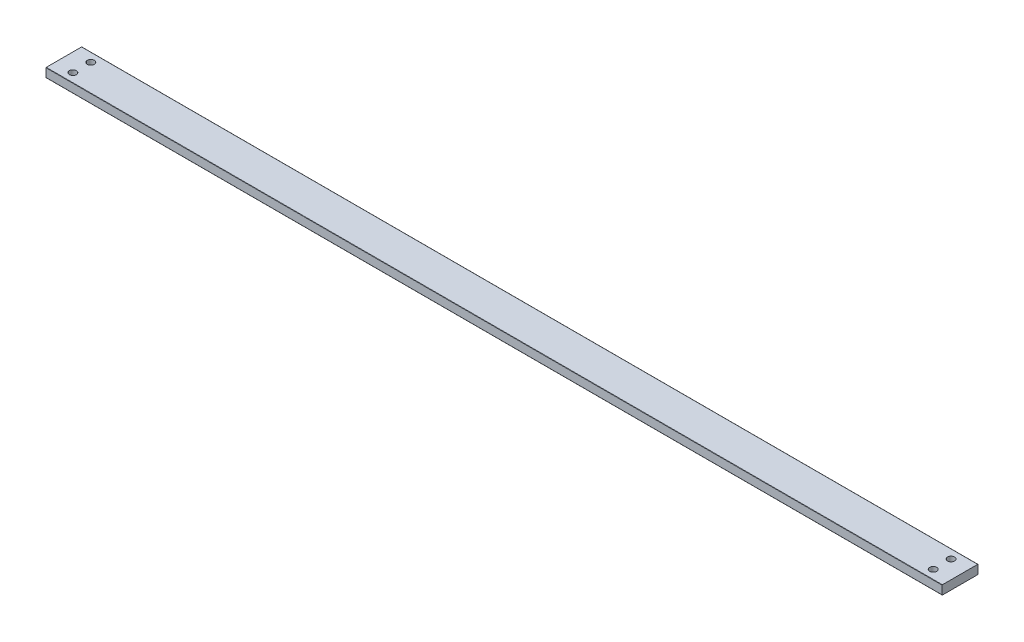
ISO-10303-21;
HEADER;
FILE_DESCRIPTION(('STEP AP214'),'2;1');
FILE_NAME('part.step','',(''),(''),'','','');
FILE_SCHEMA(('AUTOMOTIVE_DESIGN { 1 0 10303 214 1 1 1 1 }'));
ENDSEC;
DATA;
#1=APPLICATION_CONTEXT('core data for automotive mechanical design processes');
#2=APPLICATION_PROTOCOL_DEFINITION('international standard','automotive_design',2000,#1);
#3=PRODUCT_CONTEXT('',#1,'mechanical');
#4=PRODUCT('Part','Part','',(#3));
#5=PRODUCT_RELATED_PRODUCT_CATEGORY('part','',(#4));
#6=PRODUCT_DEFINITION_FORMATION('','',#4);
#7=PRODUCT_DEFINITION_CONTEXT('part definition',#1,'design');
#8=PRODUCT_DEFINITION('design','',#6,#7);
#9=PRODUCT_DEFINITION_SHAPE('','',#8);
#10=(LENGTH_UNIT() NAMED_UNIT(*) SI_UNIT(.MILLI.,.METRE.));
#11=(NAMED_UNIT(*) PLANE_ANGLE_UNIT() SI_UNIT($,.RADIAN.));
#12=(NAMED_UNIT(*) SI_UNIT($,.STERADIAN.) SOLID_ANGLE_UNIT());
#13=UNCERTAINTY_MEASURE_WITH_UNIT(LENGTH_MEASURE(1.E-05),#10,'distance_accuracy_value','');
#14=(GEOMETRIC_REPRESENTATION_CONTEXT(3) GLOBAL_UNCERTAINTY_ASSIGNED_CONTEXT((#13)) GLOBAL_UNIT_ASSIGNED_CONTEXT((#10,
#11,#12)) REPRESENTATION_CONTEXT('',''));
#15=CARTESIAN_POINT('',(0.,0.,0.));
#16=DIRECTION('',(0.,0.,1.));
#17=DIRECTION('',(1.,0.,0.));
#18=AXIS2_PLACEMENT_3D('',#15,#16,#17);
#19=CARTESIAN_POINT('',(-317.5,-3.17500000000001,-12.7));
#20=DIRECTION('',(-1.,0.,0.));
#21=DIRECTION('',(0.,0.,1.));
#22=AXIS2_PLACEMENT_3D('',#19,#20,#21);
#23=PLANE('',#22);
#24=DIRECTION('',(0.,0.,1.));
#25=VECTOR('',#24,1.);
#26=CARTESIAN_POINT('',(-317.5,-3.17500000000001,-12.7));
#27=LINE('',#26,#25);
#28=CARTESIAN_POINT('',(-317.5,-3.17500000000001,-12.49045));
#29=VERTEX_POINT('',#28);
#30=CARTESIAN_POINT('',(-317.5,-3.17500000000001,12.49045));
#31=VERTEX_POINT('',#30);
#32=EDGE_CURVE('E192',#29,#31,#27,.T.);
#33=ORIENTED_EDGE('',*,*,#32,.T.);
#34=CARTESIAN_POINT('',(-317.5,-2.96545000000001,12.49045));
#35=DIRECTION('',(-1.,0.,0.));
#36=DIRECTION('',(0.,0.,1.));
#37=AXIS2_PLACEMENT_3D('',#34,#35,#36);
#38=CIRCLE('',#37,0.20955);
#39=CARTESIAN_POINT('',(-317.5,-2.96545000000001,12.7));
#40=VERTEX_POINT('',#39);
#41=EDGE_CURVE('E170',#31,#40,#38,.T.);
#42=ORIENTED_EDGE('',*,*,#41,.T.);
#43=DIRECTION('',(0.,1.,0.));
#44=VECTOR('',#43,1.);
#45=CARTESIAN_POINT('',(-317.5,-3.17500000000001,12.7));
#46=LINE('',#45,#44);
#47=CARTESIAN_POINT('',(-317.5,2.96544999999999,12.7));
#48=VERTEX_POINT('',#47);
#49=EDGE_CURVE('E131',#40,#48,#46,.T.);
#50=ORIENTED_EDGE('',*,*,#49,.T.);
#51=CARTESIAN_POINT('',(-317.5,2.96544999999999,12.49045));
#52=DIRECTION('',(-1.,0.,0.));
#53=DIRECTION('',(0.,0.,1.));
#54=AXIS2_PLACEMENT_3D('',#51,#52,#53);
#55=CIRCLE('',#54,0.20955);
#56=CARTESIAN_POINT('',(-317.5,3.17499999999999,12.49045));
#57=VERTEX_POINT('',#56);
#58=EDGE_CURVE('E163',#48,#57,#55,.T.);
#59=ORIENTED_EDGE('',*,*,#58,.T.);
#60=DIRECTION('',(0.,0.,1.));
#61=VECTOR('',#60,1.);
#62=CARTESIAN_POINT('',(-317.5,3.17499999999999,-12.7));
#63=LINE('',#62,#61);
#64=CARTESIAN_POINT('',(-317.5,3.17499999999999,-12.49045));
#65=VERTEX_POINT('',#64);
#66=EDGE_CURVE('E187',#65,#57,#63,.T.);
#67=ORIENTED_EDGE('',*,*,#66,.F.);
#68=CARTESIAN_POINT('',(-317.5,2.96544999999999,-12.49045));
#69=DIRECTION('',(-1.,0.,0.));
#70=DIRECTION('',(0.,0.,1.));
#71=AXIS2_PLACEMENT_3D('',#68,#69,#70);
#72=CIRCLE('',#71,0.20955);
#73=CARTESIAN_POINT('',(-317.5,2.96544999999999,-12.7));
#74=VERTEX_POINT('',#73);
#75=EDGE_CURVE('E58',#65,#74,#72,.T.);
#76=ORIENTED_EDGE('',*,*,#75,.T.);
#77=DIRECTION('',(0.,1.,0.));
#78=VECTOR('',#77,1.);
#79=CARTESIAN_POINT('',(-317.5,-3.17500000000001,-12.7));
#80=LINE('',#79,#78);
#81=CARTESIAN_POINT('',(-317.5,-2.96545000000001,-12.7));
#82=VERTEX_POINT('',#81);
#83=EDGE_CURVE('E144',#82,#74,#80,.T.);
#84=ORIENTED_EDGE('',*,*,#83,.F.);
#85=CARTESIAN_POINT('',(-317.5,-2.96545000000001,-12.49045));
#86=DIRECTION('',(-1.,0.,0.));
#87=DIRECTION('',(0.,0.,1.));
#88=AXIS2_PLACEMENT_3D('',#85,#86,#87);
#89=CIRCLE('',#88,0.20955);
#90=EDGE_CURVE('E66',#82,#29,#89,.T.);
#91=ORIENTED_EDGE('',*,*,#90,.T.);
#92=EDGE_LOOP('',(#33,#42,#50,#59,#67,#76,#84,#91));
#93=FACE_BOUND('',#92,.T.);
#94=ADVANCED_FACE('F42',(#93),#23,.T.);
#95=CARTESIAN_POINT('',(-317.5,-3.17500000000001,-12.7));
#96=DIRECTION('',(0.,0.,-1.));
#97=DIRECTION('',(-1.,0.,0.));
#98=AXIS2_PLACEMENT_3D('',#95,#96,#97);
#99=PLANE('',#98);
#100=DIRECTION('',(0.,1.,0.));
#101=VECTOR('',#100,1.);
#102=CARTESIAN_POINT('',(317.5,-3.17500000000001,-12.7));
#103=LINE('',#102,#101);
#104=CARTESIAN_POINT('',(317.5,-2.96545000000001,-12.7));
#105=VERTEX_POINT('',#104);
#106=CARTESIAN_POINT('',(317.5,2.96544999999999,-12.7));
#107=VERTEX_POINT('',#106);
#108=EDGE_CURVE('E139',#105,#107,#103,.T.);
#109=ORIENTED_EDGE('',*,*,#108,.F.);
#110=DIRECTION('',(-1.,0.,0.));
#111=VECTOR('',#110,1.);
#112=CARTESIAN_POINT('',(-317.5,-2.96545000000001,-12.7));
#113=LINE('',#112,#111);
#114=EDGE_CURVE('E176',#105,#82,#113,.T.);
#115=ORIENTED_EDGE('',*,*,#114,.T.);
#116=ORIENTED_EDGE('',*,*,#83,.T.);
#117=DIRECTION('',(-1.,0.,0.));
#118=VECTOR('',#117,1.);
#119=CARTESIAN_POINT('',(-317.5,2.96544999999999,-12.7));
#120=LINE('',#119,#118);
#121=EDGE_CURVE('E173',#74,#107,#120,.F.);
#122=ORIENTED_EDGE('',*,*,#121,.T.);
#123=EDGE_LOOP('',(#109,#115,#116,#122));
#124=FACE_BOUND('',#123,.T.);
#125=ADVANCED_FACE('F207',(#124),#99,.T.);
#126=CARTESIAN_POINT('',(317.5,-3.17500000000001,-12.7));
#127=DIRECTION('',(1.,0.,0.));
#128=DIRECTION('',(0.,0.,-1.));
#129=AXIS2_PLACEMENT_3D('',#126,#127,#128);
#130=PLANE('',#129);
#131=DIRECTION('',(0.,1.,0.));
#132=VECTOR('',#131,1.);
#133=CARTESIAN_POINT('',(317.5,-3.17500000000001,12.7));
#134=LINE('',#133,#132);
#135=CARTESIAN_POINT('',(317.5,-2.96545000000001,12.7));
#136=VERTEX_POINT('',#135);
#137=CARTESIAN_POINT('',(317.5,2.96544999999999,12.7));
#138=VERTEX_POINT('',#137);
#139=EDGE_CURVE('E128',#136,#138,#134,.T.);
#140=ORIENTED_EDGE('',*,*,#139,.F.);
#141=CARTESIAN_POINT('',(317.5,-2.96545000000001,12.49045));
#142=DIRECTION('',(1.,0.,0.));
#143=DIRECTION('',(0.,0.,-1.));
#144=AXIS2_PLACEMENT_3D('',#141,#142,#143);
#145=CIRCLE('',#144,0.20955);
#146=CARTESIAN_POINT('',(317.5,-3.17500000000001,12.49045));
#147=VERTEX_POINT('',#146);
#148=EDGE_CURVE('E110',#136,#147,#145,.T.);
#149=ORIENTED_EDGE('',*,*,#148,.T.);
#150=DIRECTION('',(0.,0.,-1.));
#151=VECTOR('',#150,1.);
#152=CARTESIAN_POINT('',(317.5,-3.17500000000001,-12.7));
#153=LINE('',#152,#151);
#154=CARTESIAN_POINT('',(317.5,-3.17500000000001,-12.49045));
#155=VERTEX_POINT('',#154);
#156=EDGE_CURVE('E146',#147,#155,#153,.T.);
#157=ORIENTED_EDGE('',*,*,#156,.T.);
#158=CARTESIAN_POINT('',(317.5,-2.96545000000001,-12.49045));
#159=DIRECTION('',(1.,0.,0.));
#160=DIRECTION('',(0.,0.,-1.));
#161=AXIS2_PLACEMENT_3D('',#158,#159,#160);
#162=CIRCLE('',#161,0.20955);
#163=EDGE_CURVE('E122',#155,#105,#162,.T.);
#164=ORIENTED_EDGE('',*,*,#163,.T.);
#165=ORIENTED_EDGE('',*,*,#108,.T.);
#166=CARTESIAN_POINT('',(317.5,2.96544999999999,-12.49045));
#167=DIRECTION('',(1.,0.,0.));
#168=DIRECTION('',(0.,0.,-1.));
#169=AXIS2_PLACEMENT_3D('',#166,#167,#168);
#170=CIRCLE('',#169,0.20955);
#171=CARTESIAN_POINT('',(317.5,3.17499999999999,-12.49045));
#172=VERTEX_POINT('',#171);
#173=EDGE_CURVE('E154',#107,#172,#170,.T.);
#174=ORIENTED_EDGE('',*,*,#173,.T.);
#175=DIRECTION('',(0.,0.,-1.));
#176=VECTOR('',#175,1.);
#177=CARTESIAN_POINT('',(317.5,3.17499999999999,-12.7));
#178=LINE('',#177,#176);
#179=CARTESIAN_POINT('',(317.5,3.17499999999999,12.49045));
#180=VERTEX_POINT('',#179);
#181=EDGE_CURVE('E185',#180,#172,#178,.T.);
#182=ORIENTED_EDGE('',*,*,#181,.F.);
#183=CARTESIAN_POINT('',(317.5,2.96544999999999,12.49045));
#184=DIRECTION('',(1.,0.,0.));
#185=DIRECTION('',(0.,0.,-1.));
#186=AXIS2_PLACEMENT_3D('',#183,#184,#185);
#187=CIRCLE('',#186,0.20955);
#188=EDGE_CURVE('E133',#180,#138,#187,.T.);
#189=ORIENTED_EDGE('',*,*,#188,.T.);
#190=EDGE_LOOP('',(#140,#149,#157,#164,#165,#174,#182,#189));
#191=FACE_BOUND('',#190,.T.);
#192=ADVANCED_FACE('F136',(#191),#130,.T.);
#193=CARTESIAN_POINT('',(-317.5,-3.17500000000001,12.7));
#194=DIRECTION('',(0.,0.,1.));
#195=DIRECTION('',(1.,0.,0.));
#196=AXIS2_PLACEMENT_3D('',#193,#194,#195);
#197=PLANE('',#196);
#198=ORIENTED_EDGE('',*,*,#49,.F.);
#199=DIRECTION('',(1.,0.,0.));
#200=VECTOR('',#199,1.);
#201=CARTESIAN_POINT('',(317.5,-2.96545000000001,12.7));
#202=LINE('',#201,#200);
#203=EDGE_CURVE('E114',#40,#136,#202,.T.);
#204=ORIENTED_EDGE('',*,*,#203,.T.);
#205=ORIENTED_EDGE('',*,*,#139,.T.);
#206=DIRECTION('',(1.,0.,0.));
#207=VECTOR('',#206,1.);
#208=CARTESIAN_POINT('',(-317.5,2.96544999999999,12.7));
#209=LINE('',#208,#207);
#210=EDGE_CURVE('E134',#138,#48,#209,.F.);
#211=ORIENTED_EDGE('',*,*,#210,.T.);
#212=EDGE_LOOP('',(#198,#204,#205,#211));
#213=FACE_BOUND('',#212,.T.);
#214=ADVANCED_FACE('F127',(#213),#197,.T.);
#215=CARTESIAN_POINT('',(0.,-3.17500000000001,0.));
#216=DIRECTION('',(0.,1.,0.));
#217=DIRECTION('',(0.,0.,1.));
#218=AXIS2_PLACEMENT_3D('',#215,#216,#217);
#219=PLANE('',#218);
#220=CARTESIAN_POINT('',(304.8,-3.17500000000001,6.35));
#221=DIRECTION('',(0.,1.,0.));
#222=DIRECTION('',(0.,0.,1.));
#223=AXIS2_PLACEMENT_3D('',#220,#221,#222);
#224=CIRCLE('',#223,2.48919999999997);
#225=CARTESIAN_POINT('',(304.8,-3.17500000000001,8.83919999999997));
#226=VERTEX_POINT('',#225);
#227=EDGE_CURVE('E367',#226,#226,#224,.T.);
#228=ORIENTED_EDGE('',*,*,#227,.T.);
#229=EDGE_LOOP('',(#228));
#230=FACE_BOUND('',#229,.T.);
#231=CARTESIAN_POINT('',(-304.8,-3.17500000000001,6.35));
#232=DIRECTION('',(0.,1.,0.));
#233=DIRECTION('',(0.,0.,1.));
#234=AXIS2_PLACEMENT_3D('',#231,#232,#233);
#235=CIRCLE('',#234,2.48919999999997);
#236=CARTESIAN_POINT('',(-304.8,-3.17500000000001,8.83919999999997));
#237=VERTEX_POINT('',#236);
#238=EDGE_CURVE('E380',#237,#237,#235,.T.);
#239=ORIENTED_EDGE('',*,*,#238,.T.);
#240=EDGE_LOOP('',(#239));
#241=FACE_BOUND('',#240,.T.);
#242=CARTESIAN_POINT('',(304.8,-3.17500000000001,-6.35));
#243=DIRECTION('',(0.,1.,0.));
#244=DIRECTION('',(0.,0.,1.));
#245=AXIS2_PLACEMENT_3D('',#242,#243,#244);
#246=CIRCLE('',#245,2.48919999999997);
#247=CARTESIAN_POINT('',(304.8,-3.17500000000001,-3.86080000000003));
#248=VERTEX_POINT('',#247);
#249=EDGE_CURVE('E388',#248,#248,#246,.T.);
#250=ORIENTED_EDGE('',*,*,#249,.T.);
#251=EDGE_LOOP('',(#250));
#252=FACE_BOUND('',#251,.T.);
#253=CARTESIAN_POINT('',(-304.8,-3.17500000000001,-6.35));
#254=DIRECTION('',(0.,1.,0.));
#255=DIRECTION('',(0.,0.,1.));
#256=AXIS2_PLACEMENT_3D('',#253,#254,#255);
#257=CIRCLE('',#256,2.48919999999997);
#258=CARTESIAN_POINT('',(-304.8,-3.17500000000001,-3.86080000000003));
#259=VERTEX_POINT('',#258);
#260=EDGE_CURVE('E198',#259,#259,#257,.T.);
#261=ORIENTED_EDGE('',*,*,#260,.T.);
#262=EDGE_LOOP('',(#261));
#263=FACE_BOUND('',#262,.T.);
#264=ORIENTED_EDGE('',*,*,#156,.F.);
#265=DIRECTION('',(1.,0.,0.));
#266=VECTOR('',#265,1.);
#267=CARTESIAN_POINT('',(-317.5,-3.17500000000001,12.49045));
#268=LINE('',#267,#266);
#269=EDGE_CURVE('E115',#147,#31,#268,.F.);
#270=ORIENTED_EDGE('',*,*,#269,.T.);
#271=ORIENTED_EDGE('',*,*,#32,.F.);
#272=DIRECTION('',(-1.,0.,0.));
#273=VECTOR('',#272,1.);
#274=CARTESIAN_POINT('',(317.5,-3.17500000000001,-12.49045));
#275=LINE('',#274,#273);
#276=EDGE_CURVE('E121',#29,#155,#275,.F.);
#277=ORIENTED_EDGE('',*,*,#276,.T.);
#278=EDGE_LOOP('',(#264,#270,#271,#277));
#279=FACE_BOUND('',#278,.T.);
#280=ADVANCED_FACE('F236',(#230,#241,#252,#263,#279),#219,.F.);
#281=CARTESIAN_POINT('',(0.,3.17499999999999,0.));
#282=DIRECTION('',(0.,1.,0.));
#283=DIRECTION('',(0.,0.,1.));
#284=AXIS2_PLACEMENT_3D('',#281,#282,#283);
#285=PLANE('',#284);
#286=CARTESIAN_POINT('',(304.8,3.17499999999999,6.35));
#287=DIRECTION('',(0.,1.,0.));
#288=DIRECTION('',(0.,0.,1.));
#289=AXIS2_PLACEMENT_3D('',#286,#287,#288);
#290=CIRCLE('',#289,2.48919999999997);
#291=CARTESIAN_POINT('',(304.8,3.17499999999999,8.83919999999997));
#292=VERTEX_POINT('',#291);
#293=EDGE_CURVE('E370',#292,#292,#290,.T.);
#294=ORIENTED_EDGE('',*,*,#293,.F.);
#295=EDGE_LOOP('',(#294));
#296=FACE_BOUND('',#295,.T.);
#297=CARTESIAN_POINT('',(-304.8,3.17499999999999,6.35));
#298=DIRECTION('',(0.,1.,0.));
#299=DIRECTION('',(0.,0.,1.));
#300=AXIS2_PLACEMENT_3D('',#297,#298,#299);
#301=CIRCLE('',#300,2.48919999999997);
#302=CARTESIAN_POINT('',(-304.8,3.17499999999999,8.83919999999997));
#303=VERTEX_POINT('',#302);
#304=EDGE_CURVE('E374',#303,#303,#301,.T.);
#305=ORIENTED_EDGE('',*,*,#304,.F.);
#306=EDGE_LOOP('',(#305));
#307=FACE_BOUND('',#306,.T.);
#308=CARTESIAN_POINT('',(304.8,3.17499999999999,-6.35));
#309=DIRECTION('',(0.,1.,0.));
#310=DIRECTION('',(0.,0.,1.));
#311=AXIS2_PLACEMENT_3D('',#308,#309,#310);
#312=CIRCLE('',#311,2.48919999999997);
#313=CARTESIAN_POINT('',(304.8,3.17499999999999,-3.86080000000003));
#314=VERTEX_POINT('',#313);
#315=EDGE_CURVE('E384',#314,#314,#312,.T.);
#316=ORIENTED_EDGE('',*,*,#315,.F.);
#317=EDGE_LOOP('',(#316));
#318=FACE_BOUND('',#317,.T.);
#319=CARTESIAN_POINT('',(-304.8,3.17499999999999,-6.35));
#320=DIRECTION('',(0.,1.,0.));
#321=DIRECTION('',(0.,0.,1.));
#322=AXIS2_PLACEMENT_3D('',#319,#320,#321);
#323=CIRCLE('',#322,2.48919999999997);
#324=CARTESIAN_POINT('',(-304.8,3.17499999999999,-3.86080000000003));
#325=VERTEX_POINT('',#324);
#326=EDGE_CURVE('E392',#325,#325,#323,.T.);
#327=ORIENTED_EDGE('',*,*,#326,.F.);
#328=EDGE_LOOP('',(#327));
#329=FACE_BOUND('',#328,.T.);
#330=ORIENTED_EDGE('',*,*,#181,.T.);
#331=DIRECTION('',(-1.,0.,0.));
#332=VECTOR('',#331,1.);
#333=CARTESIAN_POINT('',(0.,3.17499999999999,-12.49045));
#334=LINE('',#333,#332);
#335=EDGE_CURVE('E11',#172,#65,#334,.T.);
#336=ORIENTED_EDGE('',*,*,#335,.T.);
#337=ORIENTED_EDGE('',*,*,#66,.T.);
#338=DIRECTION('',(1.,0.,0.));
#339=VECTOR('',#338,1.);
#340=CARTESIAN_POINT('',(0.,3.17499999999999,12.49045));
#341=LINE('',#340,#339);
#342=EDGE_CURVE('E51',#57,#180,#341,.T.);
#343=ORIENTED_EDGE('',*,*,#342,.T.);
#344=EDGE_LOOP('',(#330,#336,#337,#343));
#345=FACE_BOUND('',#344,.T.);
#346=ADVANCED_FACE('F184',(#296,#307,#318,#329,#345),#285,.T.);
#347=CARTESIAN_POINT('',(-317.5,-2.96545000000001,12.49045));
#348=DIRECTION('',(-1.,0.,0.));
#349=DIRECTION('',(0.,0.,1.));
#350=AXIS2_PLACEMENT_3D('',#347,#348,#349);
#351=CYLINDRICAL_SURFACE('',#350,0.20955);
#352=ORIENTED_EDGE('',*,*,#41,.F.);
#353=ORIENTED_EDGE('',*,*,#269,.F.);
#354=ORIENTED_EDGE('',*,*,#148,.F.);
#355=ORIENTED_EDGE('',*,*,#203,.F.);
#356=EDGE_LOOP('',(#352,#353,#354,#355));
#357=FACE_BOUND('',#356,.T.);
#358=ADVANCED_FACE('F113',(#357),#351,.T.);
#359=CARTESIAN_POINT('',(-317.5,-2.96545000000001,-12.49045));
#360=DIRECTION('',(1.,0.,0.));
#361=DIRECTION('',(0.,0.,-1.));
#362=AXIS2_PLACEMENT_3D('',#359,#360,#361);
#363=CYLINDRICAL_SURFACE('',#362,0.20955);
#364=ORIENTED_EDGE('',*,*,#163,.F.);
#365=ORIENTED_EDGE('',*,*,#276,.F.);
#366=ORIENTED_EDGE('',*,*,#90,.F.);
#367=ORIENTED_EDGE('',*,*,#114,.F.);
#368=EDGE_LOOP('',(#364,#365,#366,#367));
#369=FACE_BOUND('',#368,.T.);
#370=ADVANCED_FACE('F219',(#369),#363,.T.);
#371=CARTESIAN_POINT('',(0.,2.96544999999999,-12.49045));
#372=DIRECTION('',(-1.,0.,0.));
#373=DIRECTION('',(0.,0.,1.));
#374=AXIS2_PLACEMENT_3D('',#371,#372,#373);
#375=CYLINDRICAL_SURFACE('',#374,0.20955);
#376=ORIENTED_EDGE('',*,*,#173,.F.);
#377=ORIENTED_EDGE('',*,*,#121,.F.);
#378=ORIENTED_EDGE('',*,*,#75,.F.);
#379=ORIENTED_EDGE('',*,*,#335,.F.);
#380=EDGE_LOOP('',(#376,#377,#378,#379));
#381=FACE_BOUND('',#380,.T.);
#382=ADVANCED_FACE('F209',(#381),#375,.T.);
#383=CARTESIAN_POINT('',(0.,2.96544999999999,12.49045));
#384=DIRECTION('',(1.,0.,0.));
#385=DIRECTION('',(0.,0.,-1.));
#386=AXIS2_PLACEMENT_3D('',#383,#384,#385);
#387=CYLINDRICAL_SURFACE('',#386,0.20955);
#388=ORIENTED_EDGE('',*,*,#58,.F.);
#389=ORIENTED_EDGE('',*,*,#210,.F.);
#390=ORIENTED_EDGE('',*,*,#188,.F.);
#391=ORIENTED_EDGE('',*,*,#342,.F.);
#392=EDGE_LOOP('',(#388,#389,#390,#391));
#393=FACE_BOUND('',#392,.T.);
#394=ADVANCED_FACE('F44',(#393),#387,.T.);
#395=CARTESIAN_POINT('',(-304.8,3.17499999999999,-6.35));
#396=DIRECTION('',(0.,1.,0.));
#397=DIRECTION('',(0.,0.,1.));
#398=AXIS2_PLACEMENT_3D('',#395,#396,#397);
#399=CYLINDRICAL_SURFACE('',#398,2.48919999999997);
#400=ORIENTED_EDGE('',*,*,#260,.F.);
#401=EDGE_LOOP('',(#400));
#402=FACE_BOUND('',#401,.T.);
#403=ORIENTED_EDGE('',*,*,#326,.T.);
#404=EDGE_LOOP('',(#403));
#405=FACE_BOUND('',#404,.T.);
#406=ADVANCED_FACE('F211',(#402,#405),#399,.F.);
#407=CARTESIAN_POINT('',(304.8,3.17499999999999,-6.35));
#408=DIRECTION('',(0.,1.,0.));
#409=DIRECTION('',(0.,0.,1.));
#410=AXIS2_PLACEMENT_3D('',#407,#408,#409);
#411=CYLINDRICAL_SURFACE('',#410,2.48919999999997);
#412=ORIENTED_EDGE('',*,*,#249,.F.);
#413=EDGE_LOOP('',(#412));
#414=FACE_BOUND('',#413,.T.);
#415=ORIENTED_EDGE('',*,*,#315,.T.);
#416=EDGE_LOOP('',(#415));
#417=FACE_BOUND('',#416,.T.);
#418=ADVANCED_FACE('F216',(#414,#417),#411,.F.);
#419=CARTESIAN_POINT('',(-304.8,3.17499999999999,6.35));
#420=DIRECTION('',(0.,1.,0.));
#421=DIRECTION('',(0.,0.,1.));
#422=AXIS2_PLACEMENT_3D('',#419,#420,#421);
#423=CYLINDRICAL_SURFACE('',#422,2.48919999999997);
#424=ORIENTED_EDGE('',*,*,#238,.F.);
#425=EDGE_LOOP('',(#424));
#426=FACE_BOUND('',#425,.T.);
#427=ORIENTED_EDGE('',*,*,#304,.T.);
#428=EDGE_LOOP('',(#427));
#429=FACE_BOUND('',#428,.T.);
#430=ADVANCED_FACE('F311',(#426,#429),#423,.F.);
#431=CARTESIAN_POINT('',(304.8,3.17499999999999,6.35));
#432=DIRECTION('',(0.,1.,0.));
#433=DIRECTION('',(0.,0.,1.));
#434=AXIS2_PLACEMENT_3D('',#431,#432,#433);
#435=CYLINDRICAL_SURFACE('',#434,2.48919999999997);
#436=ORIENTED_EDGE('',*,*,#227,.F.);
#437=EDGE_LOOP('',(#436));
#438=FACE_BOUND('',#437,.T.);
#439=ORIENTED_EDGE('',*,*,#293,.T.);
#440=EDGE_LOOP('',(#439));
#441=FACE_BOUND('',#440,.T.);
#442=ADVANCED_FACE('F322',(#438,#441),#435,.F.);
#443=CLOSED_SHELL('',(#94,#125,#192,#214,#280,#346,#358,#370,#382,#394,#406,#418,#430,#442));
#444=MANIFOLD_SOLID_BREP('B2',#443);
#445=ADVANCED_BREP_SHAPE_REPRESENTATION('',(#18,#444),#14);
#446=SHAPE_DEFINITION_REPRESENTATION(#9,#445);
ENDSEC;
END-ISO-10303-21;
